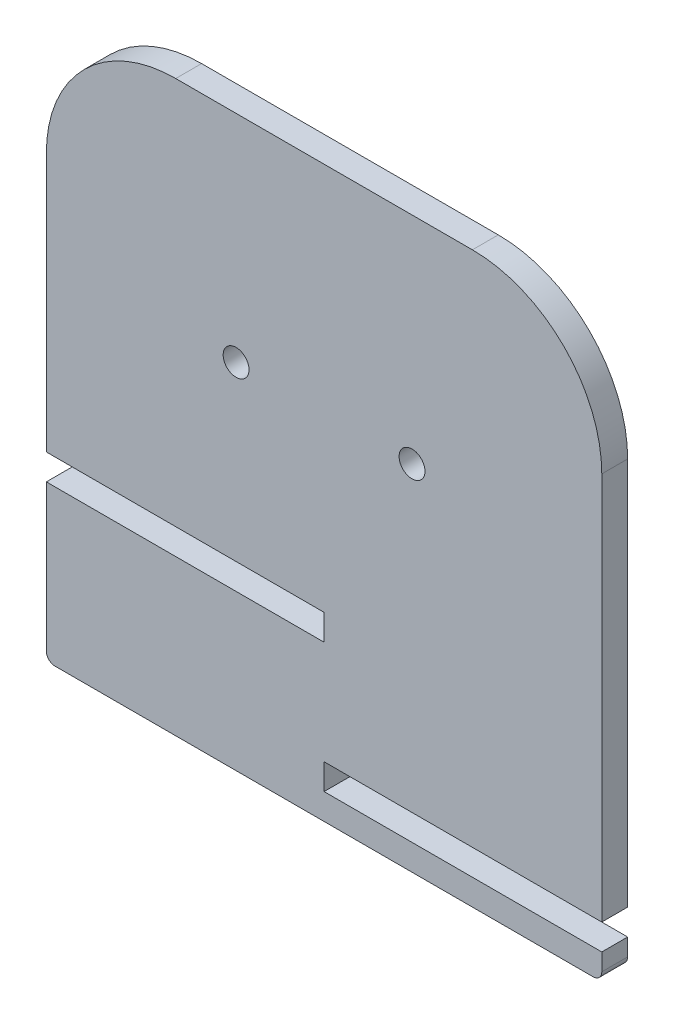
ISO-10303-21;
HEADER;
FILE_DESCRIPTION(('STEP AP214'),'2;1');
FILE_NAME('part.step','',(''),(''),'','','');
FILE_SCHEMA(('AUTOMOTIVE_DESIGN { 1 0 10303 214 1 1 1 1 }'));
ENDSEC;
DATA;
#1=APPLICATION_CONTEXT('core data for automotive mechanical design processes');
#2=APPLICATION_PROTOCOL_DEFINITION('international standard','automotive_design',2000,#1);
#3=PRODUCT_CONTEXT('',#1,'mechanical');
#4=PRODUCT('Part','Part','',(#3));
#5=PRODUCT_RELATED_PRODUCT_CATEGORY('part','',(#4));
#6=PRODUCT_DEFINITION_FORMATION('','',#4);
#7=PRODUCT_DEFINITION_CONTEXT('part definition',#1,'design');
#8=PRODUCT_DEFINITION('design','',#6,#7);
#9=PRODUCT_DEFINITION_SHAPE('','',#8);
#10=(LENGTH_UNIT() NAMED_UNIT(*) SI_UNIT(.MILLI.,.METRE.));
#11=(NAMED_UNIT(*) PLANE_ANGLE_UNIT() SI_UNIT($,.RADIAN.));
#12=(NAMED_UNIT(*) SI_UNIT($,.STERADIAN.) SOLID_ANGLE_UNIT());
#13=UNCERTAINTY_MEASURE_WITH_UNIT(LENGTH_MEASURE(1.E-05),#10,'distance_accuracy_value','');
#14=(GEOMETRIC_REPRESENTATION_CONTEXT(3) GLOBAL_UNCERTAINTY_ASSIGNED_CONTEXT((#13)) GLOBAL_UNIT_ASSIGNED_CONTEXT((#10,
#11,#12)) REPRESENTATION_CONTEXT('',''));
#15=CARTESIAN_POINT('',(0.,0.,0.));
#16=DIRECTION('',(0.,0.,1.));
#17=DIRECTION('',(1.,0.,0.));
#18=AXIS2_PLACEMENT_3D('',#15,#16,#17);
#19=CARTESIAN_POINT('',(2.7384964461708,-69.4850848039256,3.));
#20=DIRECTION('',(0.,-1.,0.));
#21=DIRECTION('',(0.,0.,-1.));
#22=AXIS2_PLACEMENT_3D('',#19,#20,#21);
#23=PLANE('',#22);
#24=DIRECTION('',(-1.,0.,0.));
#25=VECTOR('',#24,1.);
#26=CARTESIAN_POINT('',(2.7384964461708,-69.4850848039256,0.));
#27=LINE('',#26,#25);
#28=CARTESIAN_POINT('',(2.7384964461708,-69.4850848039256,0.));
#29=VERTEX_POINT('',#28);
#30=CARTESIAN_POINT('',(-29.4615035538292,-69.4850848039256,0.));
#31=VERTEX_POINT('',#30);
#32=EDGE_CURVE('E193',#29,#31,#27,.T.);
#33=ORIENTED_EDGE('',*,*,#32,.T.);
#34=DIRECTION('',(0.,0.,-1.));
#35=VECTOR('',#34,1.);
#36=CARTESIAN_POINT('',(-29.4615035538292,-69.4850848039256,3.));
#37=LINE('',#36,#35);
#38=CARTESIAN_POINT('',(-29.4615035538292,-69.4850848039256,3.));
#39=VERTEX_POINT('',#38);
#40=EDGE_CURVE('E11',#39,#31,#37,.T.);
#41=ORIENTED_EDGE('',*,*,#40,.F.);
#42=DIRECTION('',(-1.,0.,0.));
#43=VECTOR('',#42,1.);
#44=CARTESIAN_POINT('',(2.7384964461708,-69.4850848039256,3.));
#45=LINE('',#44,#43);
#46=CARTESIAN_POINT('',(2.7384964461708,-69.4850848039256,3.));
#47=VERTEX_POINT('',#46);
#48=EDGE_CURVE('E124',#47,#39,#45,.T.);
#49=ORIENTED_EDGE('',*,*,#48,.F.);
#50=DIRECTION('',(0.,0.,-1.));
#51=VECTOR('',#50,1.);
#52=CARTESIAN_POINT('',(2.7384964461708,-69.4850848039256,3.));
#53=LINE('',#52,#51);
#54=EDGE_CURVE('E62',#47,#29,#53,.T.);
#55=ORIENTED_EDGE('',*,*,#54,.T.);
#56=EDGE_LOOP('',(#33,#41,#49,#55));
#57=FACE_BOUND('',#56,.T.);
#58=ADVANCED_FACE('F45',(#57),#23,.F.);
#59=CARTESIAN_POINT('',(-29.4615035538292,-66.4850848039255,3.));
#60=DIRECTION('',(1.,0.,0.));
#61=DIRECTION('',(0.,1.,0.));
#62=AXIS2_PLACEMENT_3D('',#59,#60,#61);
#63=PLANE('',#62);
#64=DIRECTION('',(0.,-1.,0.));
#65=VECTOR('',#64,1.);
#66=CARTESIAN_POINT('',(-29.4615035538292,-66.4850848039255,0.));
#67=LINE('',#66,#65);
#68=CARTESIAN_POINT('',(-29.4615035538292,-66.4850848039255,0.));
#69=VERTEX_POINT('',#68);
#70=EDGE_CURVE('E196',#69,#31,#67,.T.);
#71=ORIENTED_EDGE('',*,*,#70,.F.);
#72=DIRECTION('',(0.,0.,-1.));
#73=VECTOR('',#72,1.);
#74=CARTESIAN_POINT('',(-29.4615035538292,-66.4850848039255,3.));
#75=LINE('',#74,#73);
#76=CARTESIAN_POINT('',(-29.4615035538292,-66.4850848039255,3.));
#77=VERTEX_POINT('',#76);
#78=EDGE_CURVE('E54',#77,#69,#75,.T.);
#79=ORIENTED_EDGE('',*,*,#78,.F.);
#80=DIRECTION('',(0.,-1.,0.));
#81=VECTOR('',#80,1.);
#82=CARTESIAN_POINT('',(-29.4615035538292,-66.4850848039255,3.));
#83=LINE('',#82,#81);
#84=EDGE_CURVE('E310',#77,#39,#83,.T.);
#85=ORIENTED_EDGE('',*,*,#84,.T.);
#86=ORIENTED_EDGE('',*,*,#40,.T.);
#87=EDGE_LOOP('',(#71,#79,#85,#86));
#88=FACE_BOUND('',#87,.T.);
#89=ADVANCED_FACE('F298',(#88),#63,.T.);
#90=CARTESIAN_POINT('',(2.7384964461708,-66.4850848039255,3.));
#91=DIRECTION('',(0.,-1.,0.));
#92=DIRECTION('',(0.,0.,-1.));
#93=AXIS2_PLACEMENT_3D('',#90,#91,#92);
#94=PLANE('',#93);
#95=DIRECTION('',(-1.,0.,0.));
#96=VECTOR('',#95,1.);
#97=CARTESIAN_POINT('',(2.7384964461708,-66.4850848039255,0.));
#98=LINE('',#97,#96);
#99=CARTESIAN_POINT('',(2.7384964461708,-66.4850848039255,0.));
#100=VERTEX_POINT('',#99);
#101=EDGE_CURVE('E201',#100,#69,#98,.T.);
#102=ORIENTED_EDGE('',*,*,#101,.F.);
#103=DIRECTION('',(0.,0.,-1.));
#104=VECTOR('',#103,1.);
#105=CARTESIAN_POINT('',(2.7384964461708,-66.4850848039255,3.));
#106=LINE('',#105,#104);
#107=CARTESIAN_POINT('',(2.7384964461708,-66.4850848039255,3.));
#108=VERTEX_POINT('',#107);
#109=EDGE_CURVE('E286',#108,#100,#106,.T.);
#110=ORIENTED_EDGE('',*,*,#109,.F.);
#111=DIRECTION('',(-1.,0.,0.));
#112=VECTOR('',#111,1.);
#113=CARTESIAN_POINT('',(2.7384964461708,-66.4850848039255,3.));
#114=LINE('',#113,#112);
#115=EDGE_CURVE('E295',#108,#77,#114,.T.);
#116=ORIENTED_EDGE('',*,*,#115,.T.);
#117=ORIENTED_EDGE('',*,*,#78,.T.);
#118=EDGE_LOOP('',(#102,#110,#116,#117));
#119=FACE_BOUND('',#118,.T.);
#120=ADVANCED_FACE('F293',(#119),#94,.T.);
#121=CARTESIAN_POINT('',(2.73849644617079,-21.4850848039255,3.));
#122=DIRECTION('',(1.,0.,0.));
#123=DIRECTION('',(0.,1.,0.));
#124=AXIS2_PLACEMENT_3D('',#121,#122,#123);
#125=PLANE('',#124);
#126=DIRECTION('',(0.,-1.,0.));
#127=VECTOR('',#126,1.);
#128=CARTESIAN_POINT('',(2.73849644617079,-21.4850848039255,0.));
#129=LINE('',#128,#127);
#130=CARTESIAN_POINT('',(2.73849644617079,-21.4850848039255,0.));
#131=VERTEX_POINT('',#130);
#132=EDGE_CURVE('E205',#131,#100,#129,.T.);
#133=ORIENTED_EDGE('',*,*,#132,.F.);
#134=DIRECTION('',(0.,0.,-1.));
#135=VECTOR('',#134,1.);
#136=CARTESIAN_POINT('',(2.73849644617079,-21.4850848039255,3.));
#137=LINE('',#136,#135);
#138=CARTESIAN_POINT('',(2.73849644617079,-21.4850848039255,3.));
#139=VERTEX_POINT('',#138);
#140=EDGE_CURVE('E283',#139,#131,#137,.T.);
#141=ORIENTED_EDGE('',*,*,#140,.F.);
#142=DIRECTION('',(0.,-1.,0.));
#143=VECTOR('',#142,1.);
#144=CARTESIAN_POINT('',(2.73849644617079,-21.4850848039255,3.));
#145=LINE('',#144,#143);
#146=EDGE_CURVE('E307',#139,#108,#145,.T.);
#147=ORIENTED_EDGE('',*,*,#146,.T.);
#148=ORIENTED_EDGE('',*,*,#109,.T.);
#149=EDGE_LOOP('',(#133,#141,#147,#148));
#150=FACE_BOUND('',#149,.T.);
#151=ADVANCED_FACE('F304',(#150),#125,.T.);
#152=CARTESIAN_POINT('',(-12.2615035538292,-21.4850848039256,3.));
#153=DIRECTION('',(0.,0.,-1.));
#154=DIRECTION('',(-1.,0.,0.));
#155=AXIS2_PLACEMENT_3D('',#152,#153,#154);
#156=CYLINDRICAL_SURFACE('',#155,15.);
#157=CARTESIAN_POINT('',(-12.2615035538292,-21.4850848039256,0.));
#158=DIRECTION('',(0.,0.,-1.));
#159=DIRECTION('',(-1.,0.,0.));
#160=AXIS2_PLACEMENT_3D('',#157,#158,#159);
#161=CIRCLE('',#160,15.);
#162=CARTESIAN_POINT('',(-12.2615035538292,-6.48508480392555,0.));
#163=VERTEX_POINT('',#162);
#164=EDGE_CURVE('E209',#163,#131,#161,.T.);
#165=ORIENTED_EDGE('',*,*,#164,.F.);
#166=DIRECTION('',(0.,0.,-1.));
#167=VECTOR('',#166,1.);
#168=CARTESIAN_POINT('',(-12.2615035538292,-6.48508480392555,3.));
#169=LINE('',#168,#167);
#170=CARTESIAN_POINT('',(-12.2615035538292,-6.48508480392555,3.));
#171=VERTEX_POINT('',#170);
#172=EDGE_CURVE('E280',#171,#163,#169,.T.);
#173=ORIENTED_EDGE('',*,*,#172,.F.);
#174=CARTESIAN_POINT('',(-12.2615035538292,-21.4850848039256,3.));
#175=DIRECTION('',(0.,0.,-1.));
#176=DIRECTION('',(-1.,0.,0.));
#177=AXIS2_PLACEMENT_3D('',#174,#175,#176);
#178=CIRCLE('',#177,15.);
#179=EDGE_CURVE('E315',#171,#139,#178,.T.);
#180=ORIENTED_EDGE('',*,*,#179,.T.);
#181=ORIENTED_EDGE('',*,*,#140,.T.);
#182=EDGE_LOOP('',(#165,#173,#180,#181));
#183=FACE_BOUND('',#182,.T.);
#184=ADVANCED_FACE('F507',(#183),#156,.T.);
#185=CARTESIAN_POINT('',(-46.6615035538292,-6.48508480392555,3.));
#186=DIRECTION('',(0.,1.,0.));
#187=DIRECTION('',(0.,0.,1.));
#188=AXIS2_PLACEMENT_3D('',#185,#186,#187);
#189=PLANE('',#188);
#190=DIRECTION('',(1.,0.,0.));
#191=VECTOR('',#190,1.);
#192=CARTESIAN_POINT('',(-46.6615035538292,-6.48508480392555,0.));
#193=LINE('',#192,#191);
#194=CARTESIAN_POINT('',(-46.6615035538292,-6.48508480392556,0.));
#195=VERTEX_POINT('',#194);
#196=EDGE_CURVE('E213',#195,#163,#193,.T.);
#197=ORIENTED_EDGE('',*,*,#196,.F.);
#198=DIRECTION('',(0.,0.,-1.));
#199=VECTOR('',#198,1.);
#200=CARTESIAN_POINT('',(-46.6615035538292,-6.48508480392556,3.));
#201=LINE('',#200,#199);
#202=CARTESIAN_POINT('',(-46.6615035538292,-6.48508480392556,3.));
#203=VERTEX_POINT('',#202);
#204=EDGE_CURVE('E277',#203,#195,#201,.T.);
#205=ORIENTED_EDGE('',*,*,#204,.F.);
#206=DIRECTION('',(1.,0.,0.));
#207=VECTOR('',#206,1.);
#208=CARTESIAN_POINT('',(-46.6615035538292,-6.48508480392555,3.));
#209=LINE('',#208,#207);
#210=EDGE_CURVE('E322',#203,#171,#209,.T.);
#211=ORIENTED_EDGE('',*,*,#210,.T.);
#212=ORIENTED_EDGE('',*,*,#172,.T.);
#213=EDGE_LOOP('',(#197,#205,#211,#212));
#214=FACE_BOUND('',#213,.T.);
#215=ADVANCED_FACE('F497',(#214),#189,.T.);
#216=CARTESIAN_POINT('',(-46.6615035538292,-21.4850848039256,3.));
#217=DIRECTION('',(0.,0.,-1.));
#218=DIRECTION('',(-1.,0.,0.));
#219=AXIS2_PLACEMENT_3D('',#216,#217,#218);
#220=CYLINDRICAL_SURFACE('',#219,15.);
#221=CARTESIAN_POINT('',(-46.6615035538292,-21.4850848039256,0.));
#222=DIRECTION('',(0.,0.,1.));
#223=DIRECTION('',(1.,0.,0.));
#224=AXIS2_PLACEMENT_3D('',#221,#222,#223);
#225=CIRCLE('',#224,15.);
#226=CARTESIAN_POINT('',(-61.6615035538292,-21.4850848039256,0.));
#227=VERTEX_POINT('',#226);
#228=EDGE_CURVE('E217',#195,#227,#225,.T.);
#229=ORIENTED_EDGE('',*,*,#228,.T.);
#230=DIRECTION('',(0.,0.,-1.));
#231=VECTOR('',#230,1.);
#232=CARTESIAN_POINT('',(-61.6615035538292,-21.4850848039256,3.));
#233=LINE('',#232,#231);
#234=CARTESIAN_POINT('',(-61.6615035538292,-21.4850848039256,3.));
#235=VERTEX_POINT('',#234);
#236=EDGE_CURVE('E273',#235,#227,#233,.T.);
#237=ORIENTED_EDGE('',*,*,#236,.F.);
#238=CARTESIAN_POINT('',(-46.6615035538292,-21.4850848039256,3.));
#239=DIRECTION('',(0.,0.,1.));
#240=DIRECTION('',(1.,0.,0.));
#241=AXIS2_PLACEMENT_3D('',#238,#239,#240);
#242=CIRCLE('',#241,15.);
#243=EDGE_CURVE('E326',#203,#235,#242,.T.);
#244=ORIENTED_EDGE('',*,*,#243,.F.);
#245=ORIENTED_EDGE('',*,*,#204,.T.);
#246=EDGE_LOOP('',(#229,#237,#244,#245));
#247=FACE_BOUND('',#246,.T.);
#248=ADVANCED_FACE('F487',(#247),#220,.T.);
#249=CARTESIAN_POINT('',(-61.6615035538292,-21.4850848039256,3.));
#250=DIRECTION('',(1.,0.,0.));
#251=DIRECTION('',(0.,1.,0.));
#252=AXIS2_PLACEMENT_3D('',#249,#250,#251);
#253=PLANE('',#252);
#254=DIRECTION('',(0.,-1.,0.));
#255=VECTOR('',#254,1.);
#256=CARTESIAN_POINT('',(-61.6615035538292,-21.4850848039256,0.));
#257=LINE('',#256,#255);
#258=CARTESIAN_POINT('',(-61.6615035538292,-51.4850848039256,0.));
#259=VERTEX_POINT('',#258);
#260=EDGE_CURVE('E220',#227,#259,#257,.T.);
#261=ORIENTED_EDGE('',*,*,#260,.T.);
#262=DIRECTION('',(0.,0.,-1.));
#263=VECTOR('',#262,1.);
#264=CARTESIAN_POINT('',(-61.6615035538292,-51.4850848039256,3.));
#265=LINE('',#264,#263);
#266=CARTESIAN_POINT('',(-61.6615035538292,-51.4850848039256,3.));
#267=VERTEX_POINT('',#266);
#268=EDGE_CURVE('E269',#267,#259,#265,.T.);
#269=ORIENTED_EDGE('',*,*,#268,.F.);
#270=DIRECTION('',(0.,-1.,0.));
#271=VECTOR('',#270,1.);
#272=CARTESIAN_POINT('',(-61.6615035538292,-21.4850848039256,3.));
#273=LINE('',#272,#271);
#274=EDGE_CURVE('E329',#235,#267,#273,.T.);
#275=ORIENTED_EDGE('',*,*,#274,.F.);
#276=ORIENTED_EDGE('',*,*,#236,.T.);
#277=EDGE_LOOP('',(#261,#269,#275,#276));
#278=FACE_BOUND('',#277,.T.);
#279=ADVANCED_FACE('F477',(#278),#253,.F.);
#280=CARTESIAN_POINT('',(-61.6615035538292,-51.4850848039256,3.));
#281=DIRECTION('',(0.,1.,0.));
#282=DIRECTION('',(0.,0.,1.));
#283=AXIS2_PLACEMENT_3D('',#280,#281,#282);
#284=PLANE('',#283);
#285=DIRECTION('',(1.,0.,0.));
#286=VECTOR('',#285,1.);
#287=CARTESIAN_POINT('',(-61.6615035538292,-51.4850848039256,0.));
#288=LINE('',#287,#286);
#289=CARTESIAN_POINT('',(-29.4615035538292,-51.4850848039256,0.));
#290=VERTEX_POINT('',#289);
#291=EDGE_CURVE('E223',#259,#290,#288,.T.);
#292=ORIENTED_EDGE('',*,*,#291,.T.);
#293=DIRECTION('',(0.,0.,-1.));
#294=VECTOR('',#293,1.);
#295=CARTESIAN_POINT('',(-29.4615035538292,-51.4850848039256,3.));
#296=LINE('',#295,#294);
#297=CARTESIAN_POINT('',(-29.4615035538292,-51.4850848039256,3.));
#298=VERTEX_POINT('',#297);
#299=EDGE_CURVE('E265',#298,#290,#296,.T.);
#300=ORIENTED_EDGE('',*,*,#299,.F.);
#301=DIRECTION('',(1.,0.,0.));
#302=VECTOR('',#301,1.);
#303=CARTESIAN_POINT('',(-61.6615035538292,-51.4850848039256,3.));
#304=LINE('',#303,#302);
#305=EDGE_CURVE('E332',#267,#298,#304,.T.);
#306=ORIENTED_EDGE('',*,*,#305,.F.);
#307=ORIENTED_EDGE('',*,*,#268,.T.);
#308=EDGE_LOOP('',(#292,#300,#306,#307));
#309=FACE_BOUND('',#308,.T.);
#310=ADVANCED_FACE('F467',(#309),#284,.F.);
#311=CARTESIAN_POINT('',(-29.4615035538292,-51.4850848039256,3.));
#312=DIRECTION('',(1.,0.,0.));
#313=DIRECTION('',(0.,0.,-1.));
#314=AXIS2_PLACEMENT_3D('',#311,#312,#313);
#315=PLANE('',#314);
#316=DIRECTION('',(0.,-1.,0.));
#317=VECTOR('',#316,1.);
#318=CARTESIAN_POINT('',(-29.4615035538292,-51.4850848039256,0.));
#319=LINE('',#318,#317);
#320=CARTESIAN_POINT('',(-29.4615035538292,-54.4850848039256,0.));
#321=VERTEX_POINT('',#320);
#322=EDGE_CURVE('E226',#290,#321,#319,.T.);
#323=ORIENTED_EDGE('',*,*,#322,.T.);
#324=DIRECTION('',(0.,0.,-1.));
#325=VECTOR('',#324,1.);
#326=CARTESIAN_POINT('',(-29.4615035538292,-54.4850848039256,3.));
#327=LINE('',#326,#325);
#328=CARTESIAN_POINT('',(-29.4615035538292,-54.4850848039256,3.));
#329=VERTEX_POINT('',#328);
#330=EDGE_CURVE('E262',#329,#321,#327,.T.);
#331=ORIENTED_EDGE('',*,*,#330,.F.);
#332=DIRECTION('',(0.,-1.,0.));
#333=VECTOR('',#332,1.);
#334=CARTESIAN_POINT('',(-29.4615035538292,-51.4850848039256,3.));
#335=LINE('',#334,#333);
#336=EDGE_CURVE('E335',#298,#329,#335,.T.);
#337=ORIENTED_EDGE('',*,*,#336,.F.);
#338=ORIENTED_EDGE('',*,*,#299,.T.);
#339=EDGE_LOOP('',(#323,#331,#337,#338));
#340=FACE_BOUND('',#339,.T.);
#341=ADVANCED_FACE('F457',(#340),#315,.F.);
#342=CARTESIAN_POINT('',(-61.6615035538292,-54.4850848039256,3.));
#343=DIRECTION('',(0.,1.,0.));
#344=DIRECTION('',(0.,0.,1.));
#345=AXIS2_PLACEMENT_3D('',#342,#343,#344);
#346=PLANE('',#345);
#347=DIRECTION('',(1.,0.,0.));
#348=VECTOR('',#347,1.);
#349=CARTESIAN_POINT('',(-61.6615035538292,-54.4850848039256,0.));
#350=LINE('',#349,#348);
#351=CARTESIAN_POINT('',(-61.6615035538292,-54.4850848039256,0.));
#352=VERTEX_POINT('',#351);
#353=EDGE_CURVE('E230',#352,#321,#350,.T.);
#354=ORIENTED_EDGE('',*,*,#353,.F.);
#355=DIRECTION('',(0.,0.,-1.));
#356=VECTOR('',#355,1.);
#357=CARTESIAN_POINT('',(-61.6615035538292,-54.4850848039256,3.));
#358=LINE('',#357,#356);
#359=CARTESIAN_POINT('',(-61.6615035538292,-54.4850848039256,3.));
#360=VERTEX_POINT('',#359);
#361=EDGE_CURVE('E259',#360,#352,#358,.T.);
#362=ORIENTED_EDGE('',*,*,#361,.F.);
#363=DIRECTION('',(1.,0.,0.));
#364=VECTOR('',#363,1.);
#365=CARTESIAN_POINT('',(-61.6615035538292,-54.4850848039256,3.));
#366=LINE('',#365,#364);
#367=EDGE_CURVE('E338',#360,#329,#366,.T.);
#368=ORIENTED_EDGE('',*,*,#367,.T.);
#369=ORIENTED_EDGE('',*,*,#330,.T.);
#370=EDGE_LOOP('',(#354,#362,#368,#369));
#371=FACE_BOUND('',#370,.T.);
#372=ADVANCED_FACE('F448',(#371),#346,.T.);
#373=CARTESIAN_POINT('',(-61.6615035538292,-54.4850848039256,3.));
#374=DIRECTION('',(1.,0.,0.));
#375=DIRECTION('',(0.,0.,-1.));
#376=AXIS2_PLACEMENT_3D('',#373,#374,#375);
#377=PLANE('',#376);
#378=DIRECTION('',(0.,-1.,0.));
#379=VECTOR('',#378,1.);
#380=CARTESIAN_POINT('',(-61.6615035538292,-54.4850848039256,0.));
#381=LINE('',#380,#379);
#382=CARTESIAN_POINT('',(-61.6615035538292,-71.4850848039255,0.));
#383=VERTEX_POINT('',#382);
#384=EDGE_CURVE('E234',#352,#383,#381,.T.);
#385=ORIENTED_EDGE('',*,*,#384,.T.);
#386=DIRECTION('',(0.,0.,-1.));
#387=VECTOR('',#386,1.);
#388=CARTESIAN_POINT('',(-61.6615035538292,-71.4850848039255,3.));
#389=LINE('',#388,#387);
#390=CARTESIAN_POINT('',(-61.6615035538292,-71.4850848039255,3.));
#391=VERTEX_POINT('',#390);
#392=EDGE_CURVE('E255',#391,#383,#389,.T.);
#393=ORIENTED_EDGE('',*,*,#392,.F.);
#394=DIRECTION('',(0.,-1.,0.));
#395=VECTOR('',#394,1.);
#396=CARTESIAN_POINT('',(-61.6615035538292,-54.4850848039256,3.));
#397=LINE('',#396,#395);
#398=EDGE_CURVE('E342',#360,#391,#397,.T.);
#399=ORIENTED_EDGE('',*,*,#398,.F.);
#400=ORIENTED_EDGE('',*,*,#361,.T.);
#401=EDGE_LOOP('',(#385,#393,#399,#400));
#402=FACE_BOUND('',#401,.T.);
#403=ADVANCED_FACE('F349',(#402),#377,.F.);
#404=CARTESIAN_POINT('',(-60.6615035538292,-71.4850848039255,3.));
#405=DIRECTION('',(0.,0.,-1.));
#406=DIRECTION('',(-1.,0.,0.));
#407=AXIS2_PLACEMENT_3D('',#404,#405,#406);
#408=CYLINDRICAL_SURFACE('',#407,1.00000000000002);
#409=CARTESIAN_POINT('',(-60.6615035538292,-71.4850848039255,0.));
#410=DIRECTION('',(0.,0.,1.));
#411=DIRECTION('',(1.,0.,0.));
#412=AXIS2_PLACEMENT_3D('',#409,#410,#411);
#413=CIRCLE('',#412,1.00000000000002);
#414=CARTESIAN_POINT('',(-60.6615035538292,-72.4850848039256,0.));
#415=VERTEX_POINT('',#414);
#416=EDGE_CURVE('E237',#383,#415,#413,.T.);
#417=ORIENTED_EDGE('',*,*,#416,.T.);
#418=DIRECTION('',(0.,0.,-1.));
#419=VECTOR('',#418,1.);
#420=CARTESIAN_POINT('',(-60.6615035538292,-72.4850848039256,3.));
#421=LINE('',#420,#419);
#422=CARTESIAN_POINT('',(-60.6615035538292,-72.4850848039256,3.));
#423=VERTEX_POINT('',#422);
#424=EDGE_CURVE('E183',#423,#415,#421,.T.);
#425=ORIENTED_EDGE('',*,*,#424,.F.);
#426=CARTESIAN_POINT('',(-60.6615035538292,-71.4850848039255,3.));
#427=DIRECTION('',(0.,0.,1.));
#428=DIRECTION('',(1.,0.,0.));
#429=AXIS2_PLACEMENT_3D('',#426,#427,#428);
#430=CIRCLE('',#429,1.00000000000002);
#431=EDGE_CURVE('E169',#391,#423,#430,.T.);
#432=ORIENTED_EDGE('',*,*,#431,.F.);
#433=ORIENTED_EDGE('',*,*,#392,.T.);
#434=EDGE_LOOP('',(#417,#425,#432,#433));
#435=FACE_BOUND('',#434,.T.);
#436=ADVANCED_FACE('F353',(#435),#408,.T.);
#437=CARTESIAN_POINT('',(-60.6615035538292,-72.4850848039256,3.));
#438=DIRECTION('',(0.,1.,0.));
#439=DIRECTION('',(-1.,0.,0.));
#440=AXIS2_PLACEMENT_3D('',#437,#438,#439);
#441=PLANE('',#440);
#442=DIRECTION('',(1.,0.,0.));
#443=VECTOR('',#442,1.);
#444=CARTESIAN_POINT('',(-60.6615035538292,-72.4850848039256,0.));
#445=LINE('',#444,#443);
#446=CARTESIAN_POINT('',(1.73849644617078,-72.4850848039256,0.));
#447=VERTEX_POINT('',#446);
#448=EDGE_CURVE('E179',#415,#447,#445,.T.);
#449=ORIENTED_EDGE('',*,*,#448,.T.);
#450=DIRECTION('',(0.,0.,-1.));
#451=VECTOR('',#450,1.);
#452=CARTESIAN_POINT('',(1.73849644617078,-72.4850848039256,3.));
#453=LINE('',#452,#451);
#454=CARTESIAN_POINT('',(1.73849644617078,-72.4850848039256,3.));
#455=VERTEX_POINT('',#454);
#456=EDGE_CURVE('E176',#455,#447,#453,.T.);
#457=ORIENTED_EDGE('',*,*,#456,.F.);
#458=DIRECTION('',(1.,0.,0.));
#459=VECTOR('',#458,1.);
#460=CARTESIAN_POINT('',(-60.6615035538292,-72.4850848039256,3.));
#461=LINE('',#460,#459);
#462=EDGE_CURVE('E163',#423,#455,#461,.T.);
#463=ORIENTED_EDGE('',*,*,#462,.F.);
#464=ORIENTED_EDGE('',*,*,#424,.T.);
#465=EDGE_LOOP('',(#449,#457,#463,#464));
#466=FACE_BOUND('',#465,.T.);
#467=ADVANCED_FACE('F177',(#466),#441,.F.);
#468=CARTESIAN_POINT('',(1.73849644617078,-71.4850848039256,3.));
#469=DIRECTION('',(0.,0.,-1.));
#470=DIRECTION('',(-1.,0.,0.));
#471=AXIS2_PLACEMENT_3D('',#468,#469,#470);
#472=CYLINDRICAL_SURFACE('',#471,1.00000000000002);
#473=CARTESIAN_POINT('',(1.73849644617078,-71.4850848039256,0.));
#474=DIRECTION('',(0.,0.,1.));
#475=DIRECTION('',(1.,0.,0.));
#476=AXIS2_PLACEMENT_3D('',#473,#474,#475);
#477=CIRCLE('',#476,1.00000000000002);
#478=CARTESIAN_POINT('',(2.7384964461708,-71.4850848039256,0.));
#479=VERTEX_POINT('',#478);
#480=EDGE_CURVE('E242',#447,#479,#477,.T.);
#481=ORIENTED_EDGE('',*,*,#480,.T.);
#482=DIRECTION('',(0.,0.,-1.));
#483=VECTOR('',#482,1.);
#484=CARTESIAN_POINT('',(2.7384964461708,-71.4850848039256,3.));
#485=LINE('',#484,#483);
#486=CARTESIAN_POINT('',(2.7384964461708,-71.4850848039256,3.));
#487=VERTEX_POINT('',#486);
#488=EDGE_CURVE('E112',#487,#479,#485,.T.);
#489=ORIENTED_EDGE('',*,*,#488,.F.);
#490=CARTESIAN_POINT('',(1.73849644617078,-71.4850848039256,3.));
#491=DIRECTION('',(0.,0.,1.));
#492=DIRECTION('',(1.,0.,0.));
#493=AXIS2_PLACEMENT_3D('',#490,#491,#492);
#494=CIRCLE('',#493,1.00000000000002);
#495=EDGE_CURVE('E167',#455,#487,#494,.T.);
#496=ORIENTED_EDGE('',*,*,#495,.F.);
#497=ORIENTED_EDGE('',*,*,#456,.T.);
#498=EDGE_LOOP('',(#481,#489,#496,#497));
#499=FACE_BOUND('',#498,.T.);
#500=ADVANCED_FACE('F185',(#499),#472,.T.);
#501=CARTESIAN_POINT('',(2.7384964461708,-69.4850848039256,3.));
#502=DIRECTION('',(1.,0.,0.));
#503=DIRECTION('',(0.,1.,0.));
#504=AXIS2_PLACEMENT_3D('',#501,#502,#503);
#505=PLANE('',#504);
#506=DIRECTION('',(0.,-1.,0.));
#507=VECTOR('',#506,1.);
#508=CARTESIAN_POINT('',(2.7384964461708,-69.4850848039256,0.));
#509=LINE('',#508,#507);
#510=EDGE_CURVE('E245',#29,#479,#509,.T.);
#511=ORIENTED_EDGE('',*,*,#510,.F.);
#512=ORIENTED_EDGE('',*,*,#54,.F.);
#513=DIRECTION('',(0.,-1.,0.));
#514=VECTOR('',#513,1.);
#515=CARTESIAN_POINT('',(2.7384964461708,-69.4850848039256,3.));
#516=LINE('',#515,#514);
#517=EDGE_CURVE('E187',#47,#487,#516,.T.);
#518=ORIENTED_EDGE('',*,*,#517,.T.);
#519=ORIENTED_EDGE('',*,*,#488,.T.);
#520=EDGE_LOOP('',(#511,#512,#518,#519));
#521=FACE_BOUND('',#520,.T.);
#522=ADVANCED_FACE('F354',(#521),#505,.T.);
#523=CARTESIAN_POINT('',(-12.2615035538292,-21.4850848039256,3.));
#524=DIRECTION('',(0.,0.,-1.));
#525=DIRECTION('',(-1.,0.,0.));
#526=AXIS2_PLACEMENT_3D('',#523,#524,#525);
#527=PLANE('',#526);
#528=CARTESIAN_POINT('',(-19.2615035538292,-31.4850848039256,3.));
#529=DIRECTION('',(0.,0.,1.));
#530=DIRECTION('',(1.,0.,0.));
#531=AXIS2_PLACEMENT_3D('',#528,#529,#530);
#532=CIRCLE('',#531,1.5);
#533=CARTESIAN_POINT('',(-17.7615035538292,-31.4850848039256,3.));
#534=VERTEX_POINT('',#533);
#535=EDGE_CURVE('E379',#534,#534,#532,.T.);
#536=ORIENTED_EDGE('',*,*,#535,.F.);
#537=EDGE_LOOP('',(#536));
#538=FACE_BOUND('',#537,.T.);
#539=CARTESIAN_POINT('',(-39.6615035538292,-31.4850848039256,3.));
#540=DIRECTION('',(0.,0.,1.));
#541=DIRECTION('',(1.,0.,0.));
#542=AXIS2_PLACEMENT_3D('',#539,#540,#541);
#543=CIRCLE('',#542,1.5);
#544=CARTESIAN_POINT('',(-38.1615035538292,-31.4850848039256,3.));
#545=VERTEX_POINT('',#544);
#546=EDGE_CURVE('E375',#545,#545,#543,.T.);
#547=ORIENTED_EDGE('',*,*,#546,.F.);
#548=EDGE_LOOP('',(#547));
#549=FACE_BOUND('',#548,.T.);
#550=ORIENTED_EDGE('',*,*,#48,.T.);
#551=ORIENTED_EDGE('',*,*,#84,.F.);
#552=ORIENTED_EDGE('',*,*,#115,.F.);
#553=ORIENTED_EDGE('',*,*,#146,.F.);
#554=ORIENTED_EDGE('',*,*,#179,.F.);
#555=ORIENTED_EDGE('',*,*,#210,.F.);
#556=ORIENTED_EDGE('',*,*,#243,.T.);
#557=ORIENTED_EDGE('',*,*,#274,.T.);
#558=ORIENTED_EDGE('',*,*,#305,.T.);
#559=ORIENTED_EDGE('',*,*,#336,.T.);
#560=ORIENTED_EDGE('',*,*,#367,.F.);
#561=ORIENTED_EDGE('',*,*,#398,.T.);
#562=ORIENTED_EDGE('',*,*,#431,.T.);
#563=ORIENTED_EDGE('',*,*,#462,.T.);
#564=ORIENTED_EDGE('',*,*,#495,.T.);
#565=ORIENTED_EDGE('',*,*,#517,.F.);
#566=EDGE_LOOP('',(#550,#551,#552,#553,#554,#555,#556,#557,#558,#559,#560,#561,#562,#563,#564,#565));
#567=FACE_BOUND('',#566,.T.);
#568=ADVANCED_FACE('F165',(#538,#549,#567),#527,.F.);
#569=CARTESIAN_POINT('',(-12.2615035538292,-21.4850848039256,0.));
#570=DIRECTION('',(0.,0.,-1.));
#571=DIRECTION('',(-1.,0.,0.));
#572=AXIS2_PLACEMENT_3D('',#569,#570,#571);
#573=PLANE('',#572);
#574=CARTESIAN_POINT('',(-19.2615035538292,-31.4850848039256,0.));
#575=DIRECTION('',(0.,0.,1.));
#576=DIRECTION('',(1.,0.,0.));
#577=AXIS2_PLACEMENT_3D('',#574,#575,#576);
#578=CIRCLE('',#577,1.5);
#579=CARTESIAN_POINT('',(-17.7615035538292,-31.4850848039256,0.));
#580=VERTEX_POINT('',#579);
#581=EDGE_CURVE('E197',#580,#580,#578,.T.);
#582=ORIENTED_EDGE('',*,*,#581,.T.);
#583=EDGE_LOOP('',(#582));
#584=FACE_BOUND('',#583,.T.);
#585=CARTESIAN_POINT('',(-39.6615035538292,-31.4850848039256,0.));
#586=DIRECTION('',(0.,0.,1.));
#587=DIRECTION('',(1.,0.,0.));
#588=AXIS2_PLACEMENT_3D('',#585,#586,#587);
#589=CIRCLE('',#588,1.5);
#590=CARTESIAN_POINT('',(-38.1615035538292,-31.4850848039256,0.));
#591=VERTEX_POINT('',#590);
#592=EDGE_CURVE('E371',#591,#591,#589,.T.);
#593=ORIENTED_EDGE('',*,*,#592,.T.);
#594=EDGE_LOOP('',(#593));
#595=FACE_BOUND('',#594,.T.);
#596=ORIENTED_EDGE('',*,*,#32,.F.);
#597=ORIENTED_EDGE('',*,*,#510,.T.);
#598=ORIENTED_EDGE('',*,*,#480,.F.);
#599=ORIENTED_EDGE('',*,*,#448,.F.);
#600=ORIENTED_EDGE('',*,*,#416,.F.);
#601=ORIENTED_EDGE('',*,*,#384,.F.);
#602=ORIENTED_EDGE('',*,*,#353,.T.);
#603=ORIENTED_EDGE('',*,*,#322,.F.);
#604=ORIENTED_EDGE('',*,*,#291,.F.);
#605=ORIENTED_EDGE('',*,*,#260,.F.);
#606=ORIENTED_EDGE('',*,*,#228,.F.);
#607=ORIENTED_EDGE('',*,*,#196,.T.);
#608=ORIENTED_EDGE('',*,*,#164,.T.);
#609=ORIENTED_EDGE('',*,*,#132,.T.);
#610=ORIENTED_EDGE('',*,*,#101,.T.);
#611=ORIENTED_EDGE('',*,*,#70,.T.);
#612=EDGE_LOOP('',(#596,#597,#598,#599,#600,#601,#602,#603,#604,#605,#606,#607,#608,#609,#610,#611));
#613=FACE_BOUND('',#612,.T.);
#614=ADVANCED_FACE('F300',(#584,#595,#613),#573,.T.);
#615=CARTESIAN_POINT('',(-39.6615035538292,-31.4850848039256,0.));
#616=DIRECTION('',(0.,0.,1.));
#617=DIRECTION('',(1.,0.,0.));
#618=AXIS2_PLACEMENT_3D('',#615,#616,#617);
#619=CYLINDRICAL_SURFACE('',#618,1.5);
#620=ORIENTED_EDGE('',*,*,#592,.F.);
#621=EDGE_LOOP('',(#620));
#622=FACE_BOUND('',#621,.T.);
#623=ORIENTED_EDGE('',*,*,#546,.T.);
#624=EDGE_LOOP('',(#623));
#625=FACE_BOUND('',#624,.T.);
#626=ADVANCED_FACE('F392',(#622,#625),#619,.F.);
#627=CARTESIAN_POINT('',(-19.2615035538292,-31.4850848039256,0.));
#628=DIRECTION('',(0.,0.,1.));
#629=DIRECTION('',(1.,0.,0.));
#630=AXIS2_PLACEMENT_3D('',#627,#628,#629);
#631=CYLINDRICAL_SURFACE('',#630,1.5);
#632=ORIENTED_EDGE('',*,*,#581,.F.);
#633=EDGE_LOOP('',(#632));
#634=FACE_BOUND('',#633,.T.);
#635=ORIENTED_EDGE('',*,*,#535,.T.);
#636=EDGE_LOOP('',(#635));
#637=FACE_BOUND('',#636,.T.);
#638=ADVANCED_FACE('F389',(#634,#637),#631,.F.);
#639=CLOSED_SHELL('',(#58,#89,#120,#151,#184,#215,#248,#279,#310,#341,#372,#403,#436,#467,#500,
#522,#568,#614,#626,#638));
#640=MANIFOLD_SOLID_BREP('B2',#639);
#641=ADVANCED_BREP_SHAPE_REPRESENTATION('',(#18,#640),#14);
#642=SHAPE_DEFINITION_REPRESENTATION(#9,#641);
ENDSEC;
END-ISO-10303-21;
